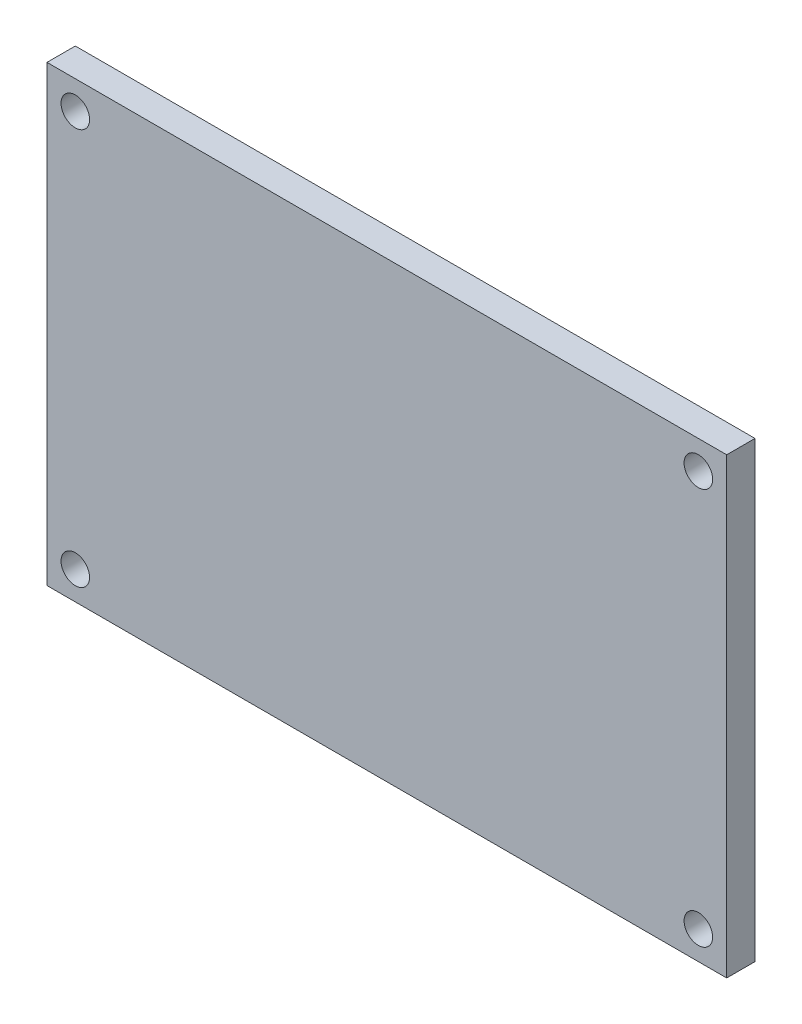
ISO-10303-21;
HEADER;
FILE_DESCRIPTION(('STEP AP214'),'2;1');
FILE_NAME('part.step','',(''),(''),'','','');
FILE_SCHEMA(('AUTOMOTIVE_DESIGN { 1 0 10303 214 1 1 1 1 }'));
ENDSEC;
DATA;
#1=APPLICATION_CONTEXT('core data for automotive mechanical design processes');
#2=APPLICATION_PROTOCOL_DEFINITION('international standard','automotive_design',2000,#1);
#3=PRODUCT_CONTEXT('',#1,'mechanical');
#4=PRODUCT('Part','Part','',(#3));
#5=PRODUCT_RELATED_PRODUCT_CATEGORY('part','',(#4));
#6=PRODUCT_DEFINITION_FORMATION('','',#4);
#7=PRODUCT_DEFINITION_CONTEXT('part definition',#1,'design');
#8=PRODUCT_DEFINITION('design','',#6,#7);
#9=PRODUCT_DEFINITION_SHAPE('','',#8);
#10=(LENGTH_UNIT() NAMED_UNIT(*) SI_UNIT(.MILLI.,.METRE.));
#11=(NAMED_UNIT(*) PLANE_ANGLE_UNIT() SI_UNIT($,.RADIAN.));
#12=(NAMED_UNIT(*) SI_UNIT($,.STERADIAN.) SOLID_ANGLE_UNIT());
#13=UNCERTAINTY_MEASURE_WITH_UNIT(LENGTH_MEASURE(1.E-05),#10,'distance_accuracy_value','');
#14=(GEOMETRIC_REPRESENTATION_CONTEXT(3) GLOBAL_UNCERTAINTY_ASSIGNED_CONTEXT((#13)) GLOBAL_UNIT_ASSIGNED_CONTEXT((#10,
#11,#12)) REPRESENTATION_CONTEXT('',''));
#15=CARTESIAN_POINT('',(0.,0.,0.));
#16=DIRECTION('',(0.,0.,1.));
#17=DIRECTION('',(1.,0.,0.));
#18=AXIS2_PLACEMENT_3D('',#15,#16,#17);
#19=CARTESIAN_POINT('',(38.1,-25.4,3.175));
#20=DIRECTION('',(-1.,0.,0.));
#21=DIRECTION('',(0.,0.,1.));
#22=AXIS2_PLACEMENT_3D('',#19,#20,#21);
#23=PLANE('',#22);
#24=DIRECTION('',(0.,1.,0.));
#25=VECTOR('',#24,1.);
#26=CARTESIAN_POINT('',(38.1,-25.4,0.));
#27=LINE('',#26,#25);
#28=CARTESIAN_POINT('',(38.1,-25.4,0.));
#29=VERTEX_POINT('',#28);
#30=CARTESIAN_POINT('',(38.1,25.4,0.));
#31=VERTEX_POINT('',#30);
#32=EDGE_CURVE('E105',#29,#31,#27,.T.);
#33=ORIENTED_EDGE('',*,*,#32,.T.);
#34=DIRECTION('',(0.,0.,-1.));
#35=VECTOR('',#34,1.);
#36=CARTESIAN_POINT('',(38.1,25.4,3.175));
#37=LINE('',#36,#35);
#38=CARTESIAN_POINT('',(38.1,25.4,3.175));
#39=VERTEX_POINT('',#38);
#40=EDGE_CURVE('E11',#39,#31,#37,.T.);
#41=ORIENTED_EDGE('',*,*,#40,.F.);
#42=DIRECTION('',(0.,1.,0.));
#43=VECTOR('',#42,1.);
#44=CARTESIAN_POINT('',(38.1,-25.4,3.175));
#45=LINE('',#44,#43);
#46=CARTESIAN_POINT('',(38.1,-25.4,3.175));
#47=VERTEX_POINT('',#46);
#48=EDGE_CURVE('E89',#47,#39,#45,.T.);
#49=ORIENTED_EDGE('',*,*,#48,.F.);
#50=DIRECTION('',(0.,0.,-1.));
#51=VECTOR('',#50,1.);
#52=CARTESIAN_POINT('',(38.1,-25.4,3.175));
#53=LINE('',#52,#51);
#54=EDGE_CURVE('E97',#47,#29,#53,.T.);
#55=ORIENTED_EDGE('',*,*,#54,.T.);
#56=EDGE_LOOP('',(#33,#41,#49,#55));
#57=FACE_BOUND('',#56,.T.);
#58=ADVANCED_FACE('F39',(#57),#23,.F.);
#59=CARTESIAN_POINT('',(-38.1,25.4,3.175));
#60=DIRECTION('',(0.,-1.,0.));
#61=DIRECTION('',(0.,0.,-1.));
#62=AXIS2_PLACEMENT_3D('',#59,#60,#61);
#63=PLANE('',#62);
#64=DIRECTION('',(-1.,0.,0.));
#65=VECTOR('',#64,1.);
#66=CARTESIAN_POINT('',(-38.1,25.4,0.));
#67=LINE('',#66,#65);
#68=CARTESIAN_POINT('',(-38.1,25.4,0.));
#69=VERTEX_POINT('',#68);
#70=EDGE_CURVE('E92',#31,#69,#67,.T.);
#71=ORIENTED_EDGE('',*,*,#70,.T.);
#72=DIRECTION('',(0.,0.,-1.));
#73=VECTOR('',#72,1.);
#74=CARTESIAN_POINT('',(-38.1,25.4,3.175));
#75=LINE('',#74,#73);
#76=CARTESIAN_POINT('',(-38.1,25.4,3.175));
#77=VERTEX_POINT('',#76);
#78=EDGE_CURVE('E50',#77,#69,#75,.T.);
#79=ORIENTED_EDGE('',*,*,#78,.F.);
#80=DIRECTION('',(-1.,0.,0.));
#81=VECTOR('',#80,1.);
#82=CARTESIAN_POINT('',(-38.1,25.4,3.175));
#83=LINE('',#82,#81);
#84=EDGE_CURVE('E82',#39,#77,#83,.T.);
#85=ORIENTED_EDGE('',*,*,#84,.F.);
#86=ORIENTED_EDGE('',*,*,#40,.T.);
#87=EDGE_LOOP('',(#71,#79,#85,#86));
#88=FACE_BOUND('',#87,.T.);
#89=ADVANCED_FACE('F93',(#88),#63,.F.);
#90=CARTESIAN_POINT('',(-38.1,-25.4,3.175));
#91=DIRECTION('',(1.,0.,0.));
#92=DIRECTION('',(0.,0.,-1.));
#93=AXIS2_PLACEMENT_3D('',#90,#91,#92);
#94=PLANE('',#93);
#95=DIRECTION('',(0.,-1.,0.));
#96=VECTOR('',#95,1.);
#97=CARTESIAN_POINT('',(-38.1,-25.4,0.));
#98=LINE('',#97,#96);
#99=CARTESIAN_POINT('',(-38.1,-25.4,0.));
#100=VERTEX_POINT('',#99);
#101=EDGE_CURVE('E75',#69,#100,#98,.T.);
#102=ORIENTED_EDGE('',*,*,#101,.T.);
#103=DIRECTION('',(0.,0.,-1.));
#104=VECTOR('',#103,1.);
#105=CARTESIAN_POINT('',(-38.1,-25.4,3.175));
#106=LINE('',#105,#104);
#107=CARTESIAN_POINT('',(-38.1,-25.4,3.175));
#108=VERTEX_POINT('',#107);
#109=EDGE_CURVE('E94',#108,#100,#106,.T.);
#110=ORIENTED_EDGE('',*,*,#109,.F.);
#111=DIRECTION('',(0.,-1.,0.));
#112=VECTOR('',#111,1.);
#113=CARTESIAN_POINT('',(-38.1,-25.4,3.175));
#114=LINE('',#113,#112);
#115=EDGE_CURVE('E88',#77,#108,#114,.T.);
#116=ORIENTED_EDGE('',*,*,#115,.F.);
#117=ORIENTED_EDGE('',*,*,#78,.T.);
#118=EDGE_LOOP('',(#102,#110,#116,#117));
#119=FACE_BOUND('',#118,.T.);
#120=ADVANCED_FACE('F96',(#119),#94,.F.);
#121=CARTESIAN_POINT('',(-38.1,-25.4,3.175));
#122=DIRECTION('',(0.,1.,0.));
#123=DIRECTION('',(0.,0.,1.));
#124=AXIS2_PLACEMENT_3D('',#121,#122,#123);
#125=PLANE('',#124);
#126=DIRECTION('',(1.,0.,0.));
#127=VECTOR('',#126,1.);
#128=CARTESIAN_POINT('',(-38.1,-25.4,0.));
#129=LINE('',#128,#127);
#130=EDGE_CURVE('E76',#100,#29,#129,.T.);
#131=ORIENTED_EDGE('',*,*,#130,.T.);
#132=ORIENTED_EDGE('',*,*,#54,.F.);
#133=DIRECTION('',(1.,0.,0.));
#134=VECTOR('',#133,1.);
#135=CARTESIAN_POINT('',(-38.1,-25.4,3.175));
#136=LINE('',#135,#134);
#137=EDGE_CURVE('E54',#108,#47,#136,.T.);
#138=ORIENTED_EDGE('',*,*,#137,.F.);
#139=ORIENTED_EDGE('',*,*,#109,.T.);
#140=EDGE_LOOP('',(#131,#132,#138,#139));
#141=FACE_BOUND('',#140,.T.);
#142=ADVANCED_FACE('F106',(#141),#125,.F.);
#143=CARTESIAN_POINT('',(0.,0.,3.175));
#144=DIRECTION('',(0.,0.,-1.));
#145=DIRECTION('',(-1.,0.,0.));
#146=AXIS2_PLACEMENT_3D('',#143,#144,#145);
#147=PLANE('',#146);
#148=CARTESIAN_POINT('',(34.925,22.2249999999999,3.175));
#149=DIRECTION('',(0.,0.,1.));
#150=DIRECTION('',(-1.,0.,0.));
#151=AXIS2_PLACEMENT_3D('',#148,#149,#150);
#152=CIRCLE('',#151,1.59999999999999);
#153=CARTESIAN_POINT('',(33.325,22.2249999999999,3.175));
#154=VERTEX_POINT('',#153);
#155=EDGE_CURVE('E122',#154,#154,#152,.T.);
#156=ORIENTED_EDGE('',*,*,#155,.F.);
#157=EDGE_LOOP('',(#156));
#158=FACE_BOUND('',#157,.T.);
#159=CARTESIAN_POINT('',(34.9249999999999,-22.2250000000001,3.175));
#160=DIRECTION('',(0.,0.,1.));
#161=DIRECTION('',(-1.,0.,0.));
#162=AXIS2_PLACEMENT_3D('',#159,#160,#161);
#163=CIRCLE('',#162,1.59999997499999);
#164=CARTESIAN_POINT('',(33.3250000249999,-22.2250000000001,3.175));
#165=VERTEX_POINT('',#164);
#166=EDGE_CURVE('E126',#165,#165,#163,.T.);
#167=ORIENTED_EDGE('',*,*,#166,.F.);
#168=EDGE_LOOP('',(#167));
#169=FACE_BOUND('',#168,.T.);
#170=CARTESIAN_POINT('',(-34.925,-22.225,3.175));
#171=DIRECTION('',(0.,0.,1.));
#172=DIRECTION('',(1.,0.,0.));
#173=AXIS2_PLACEMENT_3D('',#170,#171,#172);
#174=CIRCLE('',#173,1.59999997500001);
#175=CARTESIAN_POINT('',(-33.325000025,-22.225,3.175));
#176=VERTEX_POINT('',#175);
#177=EDGE_CURVE('E132',#176,#176,#174,.T.);
#178=ORIENTED_EDGE('',*,*,#177,.F.);
#179=EDGE_LOOP('',(#178));
#180=FACE_BOUND('',#179,.T.);
#181=CARTESIAN_POINT('',(-34.925,22.225,3.175));
#182=DIRECTION('',(0.,0.,1.));
#183=DIRECTION('',(1.,0.,0.));
#184=AXIS2_PLACEMENT_3D('',#181,#182,#183);
#185=CIRCLE('',#184,1.6);
#186=CARTESIAN_POINT('',(-33.325,22.225,3.175));
#187=VERTEX_POINT('',#186);
#188=EDGE_CURVE('E103',#187,#187,#185,.T.);
#189=ORIENTED_EDGE('',*,*,#188,.F.);
#190=EDGE_LOOP('',(#189));
#191=FACE_BOUND('',#190,.T.);
#192=ORIENTED_EDGE('',*,*,#48,.T.);
#193=ORIENTED_EDGE('',*,*,#84,.T.);
#194=ORIENTED_EDGE('',*,*,#115,.T.);
#195=ORIENTED_EDGE('',*,*,#137,.T.);
#196=EDGE_LOOP('',(#192,#193,#194,#195));
#197=FACE_BOUND('',#196,.T.);
#198=ADVANCED_FACE('F86',(#158,#169,#180,#191,#197),#147,.F.);
#199=CARTESIAN_POINT('',(0.,0.,0.));
#200=DIRECTION('',(0.,0.,-1.));
#201=DIRECTION('',(-1.,0.,0.));
#202=AXIS2_PLACEMENT_3D('',#199,#200,#201);
#203=PLANE('',#202);
#204=CARTESIAN_POINT('',(34.925,22.2249999999999,0.));
#205=DIRECTION('',(0.,0.,-1.));
#206=DIRECTION('',(-1.,0.,0.));
#207=AXIS2_PLACEMENT_3D('',#204,#205,#206);
#208=CIRCLE('',#207,1.59999999999999);
#209=CARTESIAN_POINT('',(33.325,22.2249999999999,0.));
#210=VERTEX_POINT('',#209);
#211=EDGE_CURVE('E124',#210,#210,#208,.F.);
#212=ORIENTED_EDGE('',*,*,#211,.T.);
#213=EDGE_LOOP('',(#212));
#214=FACE_BOUND('',#213,.T.);
#215=CARTESIAN_POINT('',(34.9249999999999,-22.2250000000001,0.));
#216=DIRECTION('',(0.,0.,-1.));
#217=DIRECTION('',(-1.,0.,0.));
#218=AXIS2_PLACEMENT_3D('',#215,#216,#217);
#219=CIRCLE('',#218,1.59999997499999);
#220=CARTESIAN_POINT('',(33.3250000249999,-22.2250000000001,0.));
#221=VERTEX_POINT('',#220);
#222=EDGE_CURVE('E131',#221,#221,#219,.F.);
#223=ORIENTED_EDGE('',*,*,#222,.T.);
#224=EDGE_LOOP('',(#223));
#225=FACE_BOUND('',#224,.T.);
#226=CARTESIAN_POINT('',(-34.925,-22.225,0.));
#227=DIRECTION('',(0.,0.,-1.));
#228=DIRECTION('',(-1.,0.,0.));
#229=AXIS2_PLACEMENT_3D('',#226,#227,#228);
#230=CIRCLE('',#229,1.59999997500001);
#231=CARTESIAN_POINT('',(-36.524999975,-22.225,0.));
#232=VERTEX_POINT('',#231);
#233=EDGE_CURVE('E119',#232,#232,#230,.F.);
#234=ORIENTED_EDGE('',*,*,#233,.T.);
#235=EDGE_LOOP('',(#234));
#236=FACE_BOUND('',#235,.T.);
#237=CARTESIAN_POINT('',(-34.925,22.225,0.));
#238=DIRECTION('',(0.,0.,-1.));
#239=DIRECTION('',(-1.,0.,0.));
#240=AXIS2_PLACEMENT_3D('',#237,#238,#239);
#241=CIRCLE('',#240,1.6);
#242=CARTESIAN_POINT('',(-36.525,22.225,0.));
#243=VERTEX_POINT('',#242);
#244=EDGE_CURVE('E117',#243,#243,#241,.F.);
#245=ORIENTED_EDGE('',*,*,#244,.T.);
#246=EDGE_LOOP('',(#245));
#247=FACE_BOUND('',#246,.T.);
#248=ORIENTED_EDGE('',*,*,#32,.F.);
#249=ORIENTED_EDGE('',*,*,#130,.F.);
#250=ORIENTED_EDGE('',*,*,#101,.F.);
#251=ORIENTED_EDGE('',*,*,#70,.F.);
#252=EDGE_LOOP('',(#248,#249,#250,#251));
#253=FACE_BOUND('',#252,.T.);
#254=ADVANCED_FACE('F111',(#214,#225,#236,#247,#253),#203,.T.);
#255=CARTESIAN_POINT('',(-34.925,22.225,-0.00100000000000013));
#256=DIRECTION('',(0.,0.,1.));
#257=DIRECTION('',(1.,0.,0.));
#258=AXIS2_PLACEMENT_3D('',#255,#256,#257);
#259=CYLINDRICAL_SURFACE('',#258,1.6);
#260=ORIENTED_EDGE('',*,*,#244,.F.);
#261=EDGE_LOOP('',(#260));
#262=FACE_BOUND('',#261,.T.);
#263=ORIENTED_EDGE('',*,*,#188,.T.);
#264=EDGE_LOOP('',(#263));
#265=FACE_BOUND('',#264,.T.);
#266=ADVANCED_FACE('F147',(#262,#265),#259,.F.);
#267=CARTESIAN_POINT('',(-34.925,-22.225,-0.00100000000000013));
#268=DIRECTION('',(0.,0.,1.));
#269=DIRECTION('',(1.,0.,0.));
#270=AXIS2_PLACEMENT_3D('',#267,#268,#269);
#271=CYLINDRICAL_SURFACE('',#270,1.59999997500001);
#272=ORIENTED_EDGE('',*,*,#233,.F.);
#273=EDGE_LOOP('',(#272));
#274=FACE_BOUND('',#273,.T.);
#275=ORIENTED_EDGE('',*,*,#177,.T.);
#276=EDGE_LOOP('',(#275));
#277=FACE_BOUND('',#276,.T.);
#278=ADVANCED_FACE('F145',(#274,#277),#271,.F.);
#279=CARTESIAN_POINT('',(34.9249999999999,-22.2250000000001,-0.00100000000000013));
#280=DIRECTION('',(0.,0.,1.));
#281=DIRECTION('',(1.,0.,0.));
#282=AXIS2_PLACEMENT_3D('',#279,#280,#281);
#283=CYLINDRICAL_SURFACE('',#282,1.59999997499999);
#284=ORIENTED_EDGE('',*,*,#222,.F.);
#285=EDGE_LOOP('',(#284));
#286=FACE_BOUND('',#285,.T.);
#287=ORIENTED_EDGE('',*,*,#166,.T.);
#288=EDGE_LOOP('',(#287));
#289=FACE_BOUND('',#288,.T.);
#290=ADVANCED_FACE('F144',(#286,#289),#283,.F.);
#291=CARTESIAN_POINT('',(34.925,22.2249999999999,-0.00100000000000013));
#292=DIRECTION('',(0.,0.,1.));
#293=DIRECTION('',(1.,0.,0.));
#294=AXIS2_PLACEMENT_3D('',#291,#292,#293);
#295=CYLINDRICAL_SURFACE('',#294,1.59999999999999);
#296=ORIENTED_EDGE('',*,*,#211,.F.);
#297=EDGE_LOOP('',(#296));
#298=FACE_BOUND('',#297,.T.);
#299=ORIENTED_EDGE('',*,*,#155,.T.);
#300=EDGE_LOOP('',(#299));
#301=FACE_BOUND('',#300,.T.);
#302=ADVANCED_FACE('F206',(#298,#301),#295,.F.);
#303=CLOSED_SHELL('',(#58,#89,#120,#142,#198,#254,#266,#278,#290,#302));
#304=MANIFOLD_SOLID_BREP('B2',#303);
#305=ADVANCED_BREP_SHAPE_REPRESENTATION('',(#18,#304),#14);
#306=SHAPE_DEFINITION_REPRESENTATION(#9,#305);
ENDSEC;
END-ISO-10303-21;
